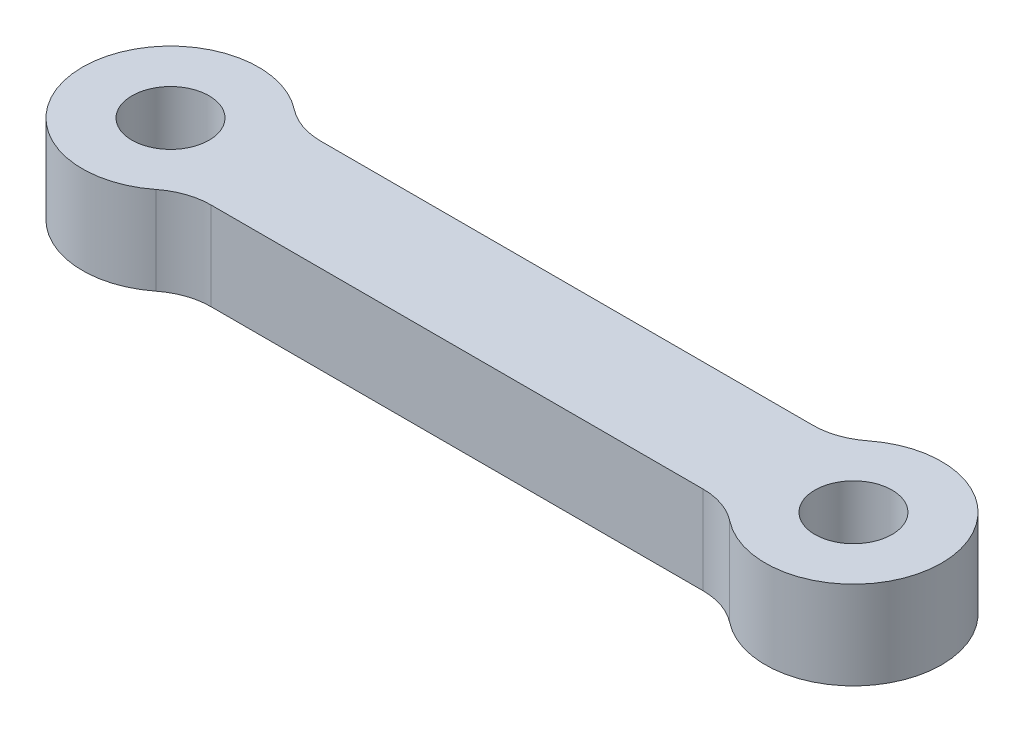
ISO-10303-21;
HEADER;
FILE_DESCRIPTION(('STEP AP214'),'2;1');
FILE_NAME('part.step','',(''),(''),'','','');
FILE_SCHEMA(('AUTOMOTIVE_DESIGN { 1 0 10303 214 1 1 1 1 }'));
ENDSEC;
DATA;
#1=APPLICATION_CONTEXT('core data for automotive mechanical design processes');
#2=APPLICATION_PROTOCOL_DEFINITION('international standard','automotive_design',2000,#1);
#3=PRODUCT_CONTEXT('',#1,'mechanical');
#4=PRODUCT('Part','Part','',(#3));
#5=PRODUCT_RELATED_PRODUCT_CATEGORY('part','',(#4));
#6=PRODUCT_DEFINITION_FORMATION('','',#4);
#7=PRODUCT_DEFINITION_CONTEXT('part definition',#1,'design');
#8=PRODUCT_DEFINITION('design','',#6,#7);
#9=PRODUCT_DEFINITION_SHAPE('','',#8);
#10=(LENGTH_UNIT() NAMED_UNIT(*) SI_UNIT(.MILLI.,.METRE.));
#11=(NAMED_UNIT(*) PLANE_ANGLE_UNIT() SI_UNIT($,.RADIAN.));
#12=(NAMED_UNIT(*) SI_UNIT($,.STERADIAN.) SOLID_ANGLE_UNIT());
#13=UNCERTAINTY_MEASURE_WITH_UNIT(LENGTH_MEASURE(1.E-05),#10,'distance_accuracy_value','');
#14=(GEOMETRIC_REPRESENTATION_CONTEXT(3) GLOBAL_UNCERTAINTY_ASSIGNED_CONTEXT((#13)) GLOBAL_UNIT_ASSIGNED_CONTEXT((#10,
#11,#12)) REPRESENTATION_CONTEXT('',''));
#15=CARTESIAN_POINT('',(0.,0.,0.));
#16=DIRECTION('',(0.,0.,1.));
#17=DIRECTION('',(1.,0.,0.));
#18=AXIS2_PLACEMENT_3D('',#15,#16,#17);
#19=CARTESIAN_POINT('',(31.,4.,0.));
#20=DIRECTION('',(0.,-1.,0.));
#21=DIRECTION('',(0.,0.,-1.));
#22=AXIS2_PLACEMENT_3D('',#19,#20,#21);
#23=CYLINDRICAL_SURFACE('',#22,4.00000000000001);
#24=CARTESIAN_POINT('',(31.,4.,0.));
#25=DIRECTION('',(0.,1.,0.));
#26=DIRECTION('',(0.,0.,1.));
#27=AXIS2_PLACEMENT_3D('',#24,#25,#26);
#28=CIRCLE('',#27,4.00000000000001);
#29=CARTESIAN_POINT('',(28.525641703473,4.,3.14285714285714));
#30=VERTEX_POINT('',#29);
#31=CARTESIAN_POINT('',(28.525641703473,4.,-3.14285714285714));
#32=VERTEX_POINT('',#31);
#33=EDGE_CURVE('E161',#30,#32,#28,.T.);
#34=ORIENTED_EDGE('',*,*,#33,.F.);
#35=DIRECTION('',(0.,-1.,0.));
#36=VECTOR('',#35,1.);
#37=CARTESIAN_POINT('',(28.525641703473,4.,3.14285714285714));
#38=LINE('',#37,#36);
#39=CARTESIAN_POINT('',(28.525641703473,0.,3.14285714285714));
#40=VERTEX_POINT('',#39);
#41=EDGE_CURVE('E173',#30,#40,#38,.T.);
#42=ORIENTED_EDGE('',*,*,#41,.T.);
#43=CARTESIAN_POINT('',(31.,0.,0.));
#44=DIRECTION('',(0.,1.,0.));
#45=DIRECTION('',(0.,0.,1.));
#46=AXIS2_PLACEMENT_3D('',#43,#44,#45);
#47=CIRCLE('',#46,4.00000000000001);
#48=CARTESIAN_POINT('',(28.525641703473,0.,-3.14285714285714));
#49=VERTEX_POINT('',#48);
#50=EDGE_CURVE('E201',#40,#49,#47,.T.);
#51=ORIENTED_EDGE('',*,*,#50,.T.);
#52=DIRECTION('',(0.,-1.,0.));
#53=VECTOR('',#52,1.);
#54=CARTESIAN_POINT('',(28.525641703473,4.,-3.14285714285714));
#55=LINE('',#54,#53);
#56=EDGE_CURVE('E170',#49,#32,#55,.F.);
#57=ORIENTED_EDGE('',*,*,#56,.T.);
#58=EDGE_LOOP('',(#34,#42,#51,#57));
#59=FACE_BOUND('',#58,.T.);
#60=ADVANCED_FACE('F47',(#59),#23,.T.);
#61=CARTESIAN_POINT('',(0.,4.,-2.5));
#62=DIRECTION('',(0.,0.,-1.));
#63=DIRECTION('',(-1.,0.,0.));
#64=AXIS2_PLACEMENT_3D('',#61,#62,#63);
#65=PLANE('',#64);
#66=DIRECTION('',(1.,0.,0.));
#67=VECTOR('',#66,1.);
#68=CARTESIAN_POINT('',(0.,4.,-2.5));
#69=LINE('',#68,#67);
#70=CARTESIAN_POINT('',(4.33012701892219,4.,-2.5));
#71=VERTEX_POINT('',#70);
#72=CARTESIAN_POINT('',(26.6698729810778,4.,-2.5));
#73=VERTEX_POINT('',#72);
#74=EDGE_CURVE('E208',#71,#73,#69,.T.);
#75=ORIENTED_EDGE('',*,*,#74,.T.);
#76=DIRECTION('',(0.,-1.,0.));
#77=VECTOR('',#76,1.);
#78=CARTESIAN_POINT('',(26.6698729810778,4.,-2.5));
#79=LINE('',#78,#77);
#80=CARTESIAN_POINT('',(26.6698729810778,0.,-2.5));
#81=VERTEX_POINT('',#80);
#82=EDGE_CURVE('E126',#73,#81,#79,.T.);
#83=ORIENTED_EDGE('',*,*,#82,.T.);
#84=DIRECTION('',(1.,0.,0.));
#85=VECTOR('',#84,1.);
#86=CARTESIAN_POINT('',(0.,0.,-2.5));
#87=LINE('',#86,#85);
#88=CARTESIAN_POINT('',(4.33012701892219,0.,-2.5));
#89=VERTEX_POINT('',#88);
#90=EDGE_CURVE('E154',#89,#81,#87,.T.);
#91=ORIENTED_EDGE('',*,*,#90,.F.);
#92=DIRECTION('',(0.,-1.,0.));
#93=VECTOR('',#92,1.);
#94=CARTESIAN_POINT('',(4.33012701892219,4.,-2.5));
#95=LINE('',#94,#93);
#96=EDGE_CURVE('E70',#89,#71,#95,.F.);
#97=ORIENTED_EDGE('',*,*,#96,.T.);
#98=EDGE_LOOP('',(#75,#83,#91,#97));
#99=FACE_BOUND('',#98,.T.);
#100=ADVANCED_FACE('F198',(#99),#65,.T.);
#101=CARTESIAN_POINT('',(0.,4.,0.));
#102=DIRECTION('',(0.,-1.,0.));
#103=DIRECTION('',(0.,0.,-1.));
#104=AXIS2_PLACEMENT_3D('',#101,#102,#103);
#105=CYLINDRICAL_SURFACE('',#104,4.);
#106=CARTESIAN_POINT('',(0.,0.,0.));
#107=DIRECTION('',(0.,1.,0.));
#108=DIRECTION('',(0.,0.,1.));
#109=AXIS2_PLACEMENT_3D('',#106,#107,#108);
#110=CIRCLE('',#109,4.);
#111=CARTESIAN_POINT('',(2.47435829652697,0.,-3.14285714285714));
#112=VERTEX_POINT('',#111);
#113=CARTESIAN_POINT('',(2.47435829652697,0.,3.14285714285714));
#114=VERTEX_POINT('',#113);
#115=EDGE_CURVE('E146',#112,#114,#110,.T.);
#116=ORIENTED_EDGE('',*,*,#115,.T.);
#117=DIRECTION('',(0.,-1.,0.));
#118=VECTOR('',#117,1.);
#119=CARTESIAN_POINT('',(2.47435829652697,4.,3.14285714285714));
#120=LINE('',#119,#118);
#121=CARTESIAN_POINT('',(2.47435829652697,4.,3.14285714285714));
#122=VERTEX_POINT('',#121);
#123=EDGE_CURVE('E119',#114,#122,#120,.F.);
#124=ORIENTED_EDGE('',*,*,#123,.T.);
#125=CARTESIAN_POINT('',(0.,4.,0.));
#126=DIRECTION('',(0.,1.,0.));
#127=DIRECTION('',(0.,0.,1.));
#128=AXIS2_PLACEMENT_3D('',#125,#126,#127);
#129=CIRCLE('',#128,4.);
#130=CARTESIAN_POINT('',(2.47435829652697,4.,-3.14285714285714));
#131=VERTEX_POINT('',#130);
#132=EDGE_CURVE('E207',#131,#122,#129,.T.);
#133=ORIENTED_EDGE('',*,*,#132,.F.);
#134=DIRECTION('',(0.,-1.,0.));
#135=VECTOR('',#134,1.);
#136=CARTESIAN_POINT('',(2.47435829652697,4.,-3.14285714285714));
#137=LINE('',#136,#135);
#138=EDGE_CURVE('E137',#131,#112,#137,.T.);
#139=ORIENTED_EDGE('',*,*,#138,.T.);
#140=EDGE_LOOP('',(#116,#124,#133,#139));
#141=FACE_BOUND('',#140,.T.);
#142=ADVANCED_FACE('F210',(#141),#105,.T.);
#143=CARTESIAN_POINT('',(0.,4.,0.));
#144=DIRECTION('',(0.,-1.,0.));
#145=DIRECTION('',(0.,0.,-1.));
#146=AXIS2_PLACEMENT_3D('',#143,#144,#145);
#147=CYLINDRICAL_SURFACE('',#146,1.75);
#148=CARTESIAN_POINT('',(0.,4.,0.));
#149=DIRECTION('',(0.,1.,0.));
#150=DIRECTION('',(0.,0.,1.));
#151=AXIS2_PLACEMENT_3D('',#148,#149,#150);
#152=CIRCLE('',#151,1.75);
#153=CARTESIAN_POINT('',(0.,4.,1.75));
#154=VERTEX_POINT('',#153);
#155=EDGE_CURVE('E216',#154,#154,#152,.T.);
#156=ORIENTED_EDGE('',*,*,#155,.T.);
#157=EDGE_LOOP('',(#156));
#158=FACE_BOUND('',#157,.T.);
#159=CARTESIAN_POINT('',(0.,0.,0.));
#160=DIRECTION('',(0.,1.,0.));
#161=DIRECTION('',(0.,0.,1.));
#162=AXIS2_PLACEMENT_3D('',#159,#160,#161);
#163=CIRCLE('',#162,1.75);
#164=CARTESIAN_POINT('',(0.,0.,1.75));
#165=VERTEX_POINT('',#164);
#166=EDGE_CURVE('E145',#165,#165,#163,.T.);
#167=ORIENTED_EDGE('',*,*,#166,.F.);
#168=EDGE_LOOP('',(#167));
#169=FACE_BOUND('',#168,.T.);
#170=ADVANCED_FACE('F266',(#158,#169),#147,.F.);
#171=CARTESIAN_POINT('',(0.,4.,2.5));
#172=DIRECTION('',(0.,0.,-1.));
#173=DIRECTION('',(-1.,0.,0.));
#174=AXIS2_PLACEMENT_3D('',#171,#172,#173);
#175=PLANE('',#174);
#176=DIRECTION('',(1.,0.,0.));
#177=VECTOR('',#176,1.);
#178=CARTESIAN_POINT('',(0.,4.,2.5));
#179=LINE('',#178,#177);
#180=CARTESIAN_POINT('',(4.3301270189222,4.,2.5));
#181=VERTEX_POINT('',#180);
#182=CARTESIAN_POINT('',(26.6698729810778,4.,2.5));
#183=VERTEX_POINT('',#182);
#184=EDGE_CURVE('E135',#181,#183,#179,.T.);
#185=ORIENTED_EDGE('',*,*,#184,.F.);
#186=DIRECTION('',(0.,1.,0.));
#187=VECTOR('',#186,1.);
#188=CARTESIAN_POINT('',(4.3301270189222,0.,2.5));
#189=LINE('',#188,#187);
#190=CARTESIAN_POINT('',(4.3301270189222,0.,2.5));
#191=VERTEX_POINT('',#190);
#192=EDGE_CURVE('E118',#181,#191,#189,.F.);
#193=ORIENTED_EDGE('',*,*,#192,.T.);
#194=DIRECTION('',(1.,0.,0.));
#195=VECTOR('',#194,1.);
#196=CARTESIAN_POINT('',(0.,0.,2.5));
#197=LINE('',#196,#195);
#198=CARTESIAN_POINT('',(26.6698729810778,0.,2.5));
#199=VERTEX_POINT('',#198);
#200=EDGE_CURVE('E132',#191,#199,#197,.T.);
#201=ORIENTED_EDGE('',*,*,#200,.T.);
#202=DIRECTION('',(0.,1.,0.));
#203=VECTOR('',#202,1.);
#204=CARTESIAN_POINT('',(26.6698729810778,4.,2.5));
#205=LINE('',#204,#203);
#206=EDGE_CURVE('E138',#199,#183,#205,.T.);
#207=ORIENTED_EDGE('',*,*,#206,.T.);
#208=EDGE_LOOP('',(#185,#193,#201,#207));
#209=FACE_BOUND('',#208,.T.);
#210=ADVANCED_FACE('F131',(#209),#175,.F.);
#211=CARTESIAN_POINT('',(31.,4.,0.));
#212=DIRECTION('',(0.,-1.,0.));
#213=DIRECTION('',(0.,0.,-1.));
#214=AXIS2_PLACEMENT_3D('',#211,#212,#213);
#215=CYLINDRICAL_SURFACE('',#214,1.75);
#216=CARTESIAN_POINT('',(31.,4.,0.));
#217=DIRECTION('',(0.,1.,0.));
#218=DIRECTION('',(0.,0.,1.));
#219=AXIS2_PLACEMENT_3D('',#216,#217,#218);
#220=CIRCLE('',#219,1.75);
#221=CARTESIAN_POINT('',(31.,4.,1.75));
#222=VERTEX_POINT('',#221);
#223=EDGE_CURVE('E163',#222,#222,#220,.T.);
#224=ORIENTED_EDGE('',*,*,#223,.T.);
#225=EDGE_LOOP('',(#224));
#226=FACE_BOUND('',#225,.T.);
#227=CARTESIAN_POINT('',(31.,0.,0.));
#228=DIRECTION('',(0.,1.,0.));
#229=DIRECTION('',(0.,0.,1.));
#230=AXIS2_PLACEMENT_3D('',#227,#228,#229);
#231=CIRCLE('',#230,1.75);
#232=CARTESIAN_POINT('',(31.,0.,1.75));
#233=VERTEX_POINT('',#232);
#234=EDGE_CURVE('E152',#233,#233,#231,.T.);
#235=ORIENTED_EDGE('',*,*,#234,.F.);
#236=EDGE_LOOP('',(#235));
#237=FACE_BOUND('',#236,.T.);
#238=ADVANCED_FACE('F260',(#226,#237),#215,.F.);
#239=CARTESIAN_POINT('',(0.,4.,0.));
#240=DIRECTION('',(0.,1.,0.));
#241=DIRECTION('',(0.,0.,1.));
#242=AXIS2_PLACEMENT_3D('',#239,#240,#241);
#243=PLANE('',#242);
#244=ORIENTED_EDGE('',*,*,#184,.T.);
#245=CARTESIAN_POINT('',(26.6698729810778,4.,5.5));
#246=DIRECTION('',(0.,1.,0.));
#247=DIRECTION('',(0.,0.,1.));
#248=AXIS2_PLACEMENT_3D('',#245,#246,#247);
#249=CIRCLE('',#248,3.);
#250=EDGE_CURVE('E186',#183,#30,#249,.F.);
#251=ORIENTED_EDGE('',*,*,#250,.T.);
#252=ORIENTED_EDGE('',*,*,#33,.T.);
#253=CARTESIAN_POINT('',(26.6698729810778,4.,-5.5));
#254=DIRECTION('',(0.,1.,0.));
#255=DIRECTION('',(0.,0.,1.));
#256=AXIS2_PLACEMENT_3D('',#253,#254,#255);
#257=CIRCLE('',#256,3.);
#258=EDGE_CURVE('E63',#32,#73,#257,.F.);
#259=ORIENTED_EDGE('',*,*,#258,.T.);
#260=ORIENTED_EDGE('',*,*,#74,.F.);
#261=CARTESIAN_POINT('',(4.33012701892219,4.,-5.5));
#262=DIRECTION('',(0.,1.,0.));
#263=DIRECTION('',(0.,0.,1.));
#264=AXIS2_PLACEMENT_3D('',#261,#262,#263);
#265=CIRCLE('',#264,3.);
#266=EDGE_CURVE('E11',#71,#131,#265,.F.);
#267=ORIENTED_EDGE('',*,*,#266,.T.);
#268=ORIENTED_EDGE('',*,*,#132,.T.);
#269=CARTESIAN_POINT('',(4.3301270189222,4.,5.5));
#270=DIRECTION('',(0.,1.,0.));
#271=DIRECTION('',(0.,0.,1.));
#272=AXIS2_PLACEMENT_3D('',#269,#270,#271);
#273=CIRCLE('',#272,3.);
#274=EDGE_CURVE('E125',#122,#181,#273,.F.);
#275=ORIENTED_EDGE('',*,*,#274,.T.);
#276=EDGE_LOOP('',(#244,#251,#252,#259,#260,#267,#268,#275));
#277=FACE_BOUND('',#276,.T.);
#278=ORIENTED_EDGE('',*,*,#155,.F.);
#279=EDGE_LOOP('',(#278));
#280=FACE_BOUND('',#279,.T.);
#281=ORIENTED_EDGE('',*,*,#223,.F.);
#282=EDGE_LOOP('',(#281));
#283=FACE_BOUND('',#282,.T.);
#284=ADVANCED_FACE('F205',(#277,#280,#283),#243,.T.);
#285=CARTESIAN_POINT('',(0.,0.,0.));
#286=DIRECTION('',(0.,1.,0.));
#287=DIRECTION('',(0.,0.,1.));
#288=AXIS2_PLACEMENT_3D('',#285,#286,#287);
#289=PLANE('',#288);
#290=ORIENTED_EDGE('',*,*,#50,.F.);
#291=CARTESIAN_POINT('',(26.6698729810778,0.,5.5));
#292=DIRECTION('',(0.,1.,0.));
#293=DIRECTION('',(0.,0.,1.));
#294=AXIS2_PLACEMENT_3D('',#291,#292,#293);
#295=CIRCLE('',#294,3.);
#296=EDGE_CURVE('E143',#40,#199,#295,.T.);
#297=ORIENTED_EDGE('',*,*,#296,.T.);
#298=ORIENTED_EDGE('',*,*,#200,.F.);
#299=CARTESIAN_POINT('',(4.3301270189222,0.,5.5));
#300=DIRECTION('',(0.,1.,0.));
#301=DIRECTION('',(0.,0.,1.));
#302=AXIS2_PLACEMENT_3D('',#299,#300,#301);
#303=CIRCLE('',#302,3.);
#304=EDGE_CURVE('E114',#191,#114,#303,.T.);
#305=ORIENTED_EDGE('',*,*,#304,.T.);
#306=ORIENTED_EDGE('',*,*,#115,.F.);
#307=CARTESIAN_POINT('',(4.33012701892219,0.,-5.5));
#308=DIRECTION('',(0.,1.,0.));
#309=DIRECTION('',(0.,0.,1.));
#310=AXIS2_PLACEMENT_3D('',#307,#308,#309);
#311=CIRCLE('',#310,3.);
#312=EDGE_CURVE('E56',#112,#89,#311,.T.);
#313=ORIENTED_EDGE('',*,*,#312,.T.);
#314=ORIENTED_EDGE('',*,*,#90,.T.);
#315=CARTESIAN_POINT('',(26.6698729810778,0.,-5.5));
#316=DIRECTION('',(0.,1.,0.));
#317=DIRECTION('',(0.,0.,1.));
#318=AXIS2_PLACEMENT_3D('',#315,#316,#317);
#319=CIRCLE('',#318,3.);
#320=EDGE_CURVE('E189',#81,#49,#319,.T.);
#321=ORIENTED_EDGE('',*,*,#320,.T.);
#322=EDGE_LOOP('',(#290,#297,#298,#305,#306,#313,#314,#321));
#323=FACE_BOUND('',#322,.T.);
#324=ORIENTED_EDGE('',*,*,#166,.T.);
#325=EDGE_LOOP('',(#324));
#326=FACE_BOUND('',#325,.T.);
#327=ORIENTED_EDGE('',*,*,#234,.T.);
#328=EDGE_LOOP('',(#327));
#329=FACE_BOUND('',#328,.T.);
#330=ADVANCED_FACE('F141',(#323,#326,#329),#289,.F.);
#331=CARTESIAN_POINT('',(4.3301270189222,4.,5.5));
#332=DIRECTION('',(0.,-1.,0.));
#333=DIRECTION('',(0.,0.,-1.));
#334=AXIS2_PLACEMENT_3D('',#331,#332,#333);
#335=CYLINDRICAL_SURFACE('',#334,3.);
#336=ORIENTED_EDGE('',*,*,#274,.F.);
#337=ORIENTED_EDGE('',*,*,#123,.F.);
#338=ORIENTED_EDGE('',*,*,#304,.F.);
#339=ORIENTED_EDGE('',*,*,#192,.F.);
#340=EDGE_LOOP('',(#336,#337,#338,#339));
#341=FACE_BOUND('',#340,.T.);
#342=ADVANCED_FACE('F117',(#341),#335,.F.);
#343=CARTESIAN_POINT('',(26.6698729810778,4.,5.5));
#344=DIRECTION('',(0.,-1.,0.));
#345=DIRECTION('',(0.,0.,-1.));
#346=AXIS2_PLACEMENT_3D('',#343,#344,#345);
#347=CYLINDRICAL_SURFACE('',#346,3.);
#348=ORIENTED_EDGE('',*,*,#250,.F.);
#349=ORIENTED_EDGE('',*,*,#206,.F.);
#350=ORIENTED_EDGE('',*,*,#296,.F.);
#351=ORIENTED_EDGE('',*,*,#41,.F.);
#352=EDGE_LOOP('',(#348,#349,#350,#351));
#353=FACE_BOUND('',#352,.T.);
#354=ADVANCED_FACE('F237',(#353),#347,.F.);
#355=CARTESIAN_POINT('',(26.6698729810778,4.,-5.5));
#356=DIRECTION('',(0.,-1.,0.));
#357=DIRECTION('',(0.,0.,-1.));
#358=AXIS2_PLACEMENT_3D('',#355,#356,#357);
#359=CYLINDRICAL_SURFACE('',#358,3.);
#360=ORIENTED_EDGE('',*,*,#258,.F.);
#361=ORIENTED_EDGE('',*,*,#56,.F.);
#362=ORIENTED_EDGE('',*,*,#320,.F.);
#363=ORIENTED_EDGE('',*,*,#82,.F.);
#364=EDGE_LOOP('',(#360,#361,#362,#363));
#365=FACE_BOUND('',#364,.T.);
#366=ADVANCED_FACE('F235',(#365),#359,.F.);
#367=CARTESIAN_POINT('',(4.33012701892219,4.,-5.5));
#368=DIRECTION('',(0.,-1.,0.));
#369=DIRECTION('',(0.,0.,-1.));
#370=AXIS2_PLACEMENT_3D('',#367,#368,#369);
#371=CYLINDRICAL_SURFACE('',#370,3.);
#372=ORIENTED_EDGE('',*,*,#266,.F.);
#373=ORIENTED_EDGE('',*,*,#96,.F.);
#374=ORIENTED_EDGE('',*,*,#312,.F.);
#375=ORIENTED_EDGE('',*,*,#138,.F.);
#376=EDGE_LOOP('',(#372,#373,#374,#375));
#377=FACE_BOUND('',#376,.T.);
#378=ADVANCED_FACE('F49',(#377),#371,.F.);
#379=CLOSED_SHELL('',(#60,#100,#142,#170,#210,#238,#284,#330,#342,#354,#366,#378));
#380=MANIFOLD_SOLID_BREP('B2',#379);
#381=ADVANCED_BREP_SHAPE_REPRESENTATION('',(#18,#380),#14);
#382=SHAPE_DEFINITION_REPRESENTATION(#9,#381);
ENDSEC;
END-ISO-10303-21;
